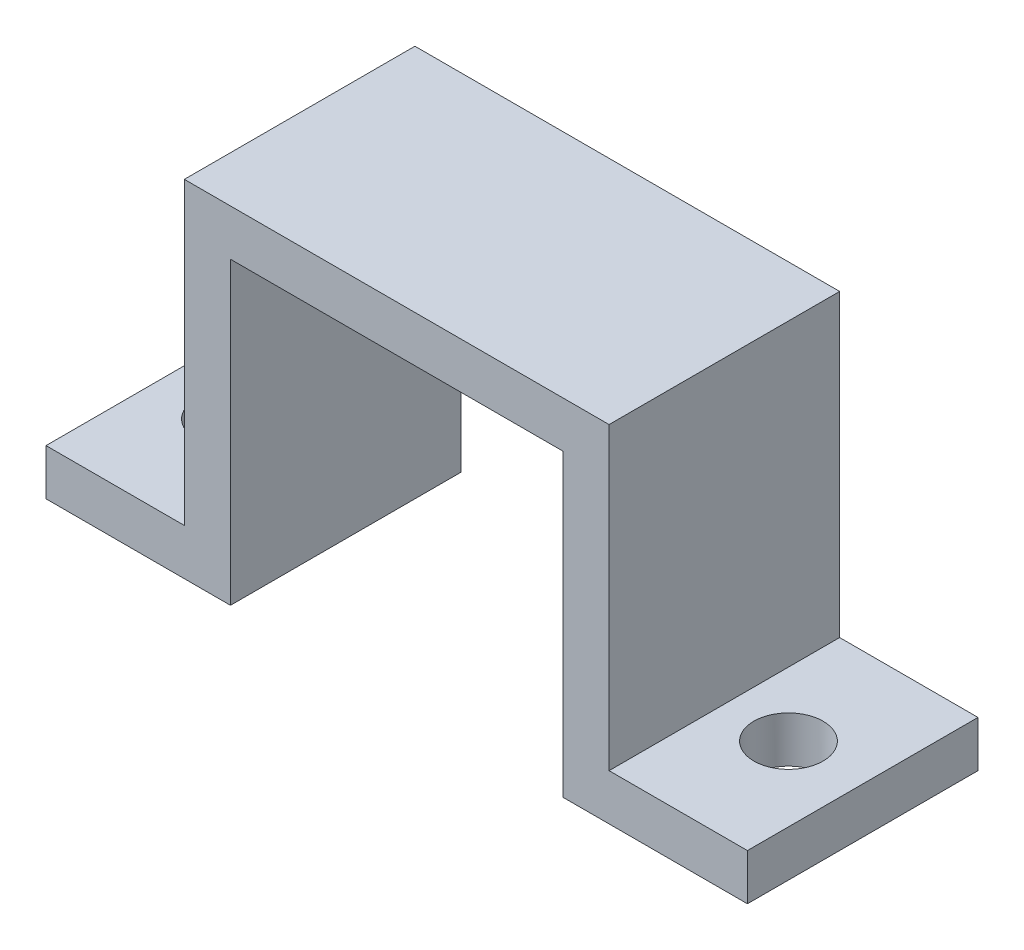
ISO-10303-21;
HEADER;
FILE_DESCRIPTION(('STEP AP214'),'2;1');
FILE_NAME('part.step','',(''),(''),'','','');
FILE_SCHEMA(('AUTOMOTIVE_DESIGN { 1 0 10303 214 1 1 1 1 }'));
ENDSEC;
DATA;
#1=APPLICATION_CONTEXT('core data for automotive mechanical design processes');
#2=APPLICATION_PROTOCOL_DEFINITION('international standard','automotive_design',2000,#1);
#3=PRODUCT_CONTEXT('',#1,'mechanical');
#4=PRODUCT('Part','Part','',(#3));
#5=PRODUCT_RELATED_PRODUCT_CATEGORY('part','',(#4));
#6=PRODUCT_DEFINITION_FORMATION('','',#4);
#7=PRODUCT_DEFINITION_CONTEXT('part definition',#1,'design');
#8=PRODUCT_DEFINITION('design','',#6,#7);
#9=PRODUCT_DEFINITION_SHAPE('','',#8);
#10=(LENGTH_UNIT() NAMED_UNIT(*) SI_UNIT(.MILLI.,.METRE.));
#11=(NAMED_UNIT(*) PLANE_ANGLE_UNIT() SI_UNIT($,.RADIAN.));
#12=(NAMED_UNIT(*) SI_UNIT($,.STERADIAN.) SOLID_ANGLE_UNIT());
#13=UNCERTAINTY_MEASURE_WITH_UNIT(LENGTH_MEASURE(1.E-05),#10,'distance_accuracy_value','');
#14=(GEOMETRIC_REPRESENTATION_CONTEXT(3) GLOBAL_UNCERTAINTY_ASSIGNED_CONTEXT((#13)) GLOBAL_UNIT_ASSIGNED_CONTEXT((#10,
#11,#12)) REPRESENTATION_CONTEXT('',''));
#15=CARTESIAN_POINT('',(0.,0.,0.));
#16=DIRECTION('',(0.,0.,1.));
#17=DIRECTION('',(1.,0.,0.));
#18=AXIS2_PLACEMENT_3D('',#15,#16,#17);
#19=CARTESIAN_POINT('',(-8.08835106382979,-3.52101063829787,10.));
#20=DIRECTION('',(0.,1.,0.));
#21=DIRECTION('',(-1.,0.,0.));
#22=AXIS2_PLACEMENT_3D('',#19,#20,#21);
#23=PLANE('',#22);
#24=CARTESIAN_POINT('',(-13.0883510638298,-3.52101063829787,5.));
#25=DIRECTION('',(0.,1.,0.));
#26=DIRECTION('',(0.,0.,1.));
#27=AXIS2_PLACEMENT_3D('',#24,#25,#26);
#28=CIRCLE('',#27,1.5);
#29=CARTESIAN_POINT('',(-13.0883510638298,-3.52101063829787,6.5));
#30=VERTEX_POINT('',#29);
#31=EDGE_CURVE('E240',#30,#30,#28,.T.);
#32=ORIENTED_EDGE('',*,*,#31,.T.);
#33=EDGE_LOOP('',(#32));
#34=FACE_BOUND('',#33,.T.);
#35=DIRECTION('',(1.,0.,0.));
#36=VECTOR('',#35,1.);
#37=CARTESIAN_POINT('',(-8.08835106382979,-3.52101063829787,0.));
#38=LINE('',#37,#36);
#39=CARTESIAN_POINT('',(-16.0883510638298,-3.52101063829787,0.));
#40=VERTEX_POINT('',#39);
#41=CARTESIAN_POINT('',(-8.08835106382979,-3.52101063829787,0.));
#42=VERTEX_POINT('',#41);
#43=EDGE_CURVE('E170',#40,#42,#38,.T.);
#44=ORIENTED_EDGE('',*,*,#43,.T.);
#45=DIRECTION('',(0.,0.,-1.));
#46=VECTOR('',#45,1.);
#47=CARTESIAN_POINT('',(-8.08835106382979,-3.52101063829787,10.));
#48=LINE('',#47,#46);
#49=CARTESIAN_POINT('',(-8.08835106382979,-3.52101063829787,10.));
#50=VERTEX_POINT('',#49);
#51=EDGE_CURVE('E11',#50,#42,#48,.T.);
#52=ORIENTED_EDGE('',*,*,#51,.F.);
#53=DIRECTION('',(1.,0.,0.));
#54=VECTOR('',#53,1.);
#55=CARTESIAN_POINT('',(-8.08835106382979,-3.52101063829787,10.));
#56=LINE('',#55,#54);
#57=CARTESIAN_POINT('',(-16.0883510638298,-3.52101063829787,10.));
#58=VERTEX_POINT('',#57);
#59=EDGE_CURVE('E204',#58,#50,#56,.T.);
#60=ORIENTED_EDGE('',*,*,#59,.F.);
#61=DIRECTION('',(0.,0.,-1.));
#62=VECTOR('',#61,1.);
#63=CARTESIAN_POINT('',(-16.0883510638298,-3.52101063829787,10.));
#64=LINE('',#63,#62);
#65=EDGE_CURVE('E166',#58,#40,#64,.T.);
#66=ORIENTED_EDGE('',*,*,#65,.T.);
#67=EDGE_LOOP('',(#44,#52,#60,#66));
#68=FACE_BOUND('',#67,.T.);
#69=ADVANCED_FACE('F43',(#34,#68),#23,.F.);
#70=CARTESIAN_POINT('',(-8.08835106382979,9.47898936170213,10.));
#71=DIRECTION('',(-1.,0.,0.));
#72=DIRECTION('',(0.,-1.,0.));
#73=AXIS2_PLACEMENT_3D('',#70,#71,#72);
#74=PLANE('',#73);
#75=DIRECTION('',(0.,1.,0.));
#76=VECTOR('',#75,1.);
#77=CARTESIAN_POINT('',(-8.08835106382979,9.47898936170213,0.));
#78=LINE('',#77,#76);
#79=CARTESIAN_POINT('',(-8.08835106382979,9.47898936170213,0.));
#80=VERTEX_POINT('',#79);
#81=EDGE_CURVE('E174',#42,#80,#78,.T.);
#82=ORIENTED_EDGE('',*,*,#81,.T.);
#83=DIRECTION('',(0.,0.,-1.));
#84=VECTOR('',#83,1.);
#85=CARTESIAN_POINT('',(-8.08835106382979,9.47898936170213,10.));
#86=LINE('',#85,#84);
#87=CARTESIAN_POINT('',(-8.08835106382979,9.47898936170213,10.));
#88=VERTEX_POINT('',#87);
#89=EDGE_CURVE('E53',#88,#80,#86,.T.);
#90=ORIENTED_EDGE('',*,*,#89,.F.);
#91=DIRECTION('',(0.,1.,0.));
#92=VECTOR('',#91,1.);
#93=CARTESIAN_POINT('',(-8.08835106382979,9.47898936170213,10.));
#94=LINE('',#93,#92);
#95=EDGE_CURVE('E117',#50,#88,#94,.T.);
#96=ORIENTED_EDGE('',*,*,#95,.F.);
#97=ORIENTED_EDGE('',*,*,#51,.T.);
#98=EDGE_LOOP('',(#82,#90,#96,#97));
#99=FACE_BOUND('',#98,.T.);
#100=ADVANCED_FACE('F305',(#99),#74,.F.);
#101=CARTESIAN_POINT('',(6.33164893617021,9.47898936170213,10.));
#102=DIRECTION('',(0.,1.,0.));
#103=DIRECTION('',(-1.,0.,0.));
#104=AXIS2_PLACEMENT_3D('',#101,#102,#103);
#105=PLANE('',#104);
#106=DIRECTION('',(1.,0.,0.));
#107=VECTOR('',#106,1.);
#108=CARTESIAN_POINT('',(6.33164893617021,9.47898936170213,0.));
#109=LINE('',#108,#107);
#110=CARTESIAN_POINT('',(6.33164893617021,9.47898936170213,0.));
#111=VERTEX_POINT('',#110);
#112=EDGE_CURVE('E177',#80,#111,#109,.T.);
#113=ORIENTED_EDGE('',*,*,#112,.T.);
#114=DIRECTION('',(0.,0.,-1.));
#115=VECTOR('',#114,1.);
#116=CARTESIAN_POINT('',(6.33164893617021,9.47898936170213,10.));
#117=LINE('',#116,#115);
#118=CARTESIAN_POINT('',(6.33164893617021,9.47898936170213,10.));
#119=VERTEX_POINT('',#118);
#120=EDGE_CURVE('E231',#119,#111,#117,.T.);
#121=ORIENTED_EDGE('',*,*,#120,.F.);
#122=DIRECTION('',(1.,0.,0.));
#123=VECTOR('',#122,1.);
#124=CARTESIAN_POINT('',(6.33164893617021,9.47898936170213,10.));
#125=LINE('',#124,#123);
#126=EDGE_CURVE('E259',#88,#119,#125,.T.);
#127=ORIENTED_EDGE('',*,*,#126,.F.);
#128=ORIENTED_EDGE('',*,*,#89,.T.);
#129=EDGE_LOOP('',(#113,#121,#127,#128));
#130=FACE_BOUND('',#129,.T.);
#131=ADVANCED_FACE('F309',(#130),#105,.F.);
#132=CARTESIAN_POINT('',(6.33164893617021,-3.52101063829787,10.));
#133=DIRECTION('',(1.,0.,0.));
#134=DIRECTION('',(0.,1.,0.));
#135=AXIS2_PLACEMENT_3D('',#132,#133,#134);
#136=PLANE('',#135);
#137=DIRECTION('',(0.,-1.,0.));
#138=VECTOR('',#137,1.);
#139=CARTESIAN_POINT('',(6.33164893617021,-3.52101063829787,0.));
#140=LINE('',#139,#138);
#141=CARTESIAN_POINT('',(6.33164893617021,-3.52101063829787,0.));
#142=VERTEX_POINT('',#141);
#143=EDGE_CURVE('E180',#111,#142,#140,.T.);
#144=ORIENTED_EDGE('',*,*,#143,.T.);
#145=DIRECTION('',(0.,0.,-1.));
#146=VECTOR('',#145,1.);
#147=CARTESIAN_POINT('',(6.33164893617021,-3.52101063829787,10.));
#148=LINE('',#147,#146);
#149=CARTESIAN_POINT('',(6.33164893617021,-3.52101063829787,10.));
#150=VERTEX_POINT('',#149);
#151=EDGE_CURVE('E227',#150,#142,#148,.T.);
#152=ORIENTED_EDGE('',*,*,#151,.F.);
#153=DIRECTION('',(0.,-1.,0.));
#154=VECTOR('',#153,1.);
#155=CARTESIAN_POINT('',(6.33164893617021,-3.52101063829787,10.));
#156=LINE('',#155,#154);
#157=EDGE_CURVE('E262',#119,#150,#156,.T.);
#158=ORIENTED_EDGE('',*,*,#157,.F.);
#159=ORIENTED_EDGE('',*,*,#120,.T.);
#160=EDGE_LOOP('',(#144,#152,#158,#159));
#161=FACE_BOUND('',#160,.T.);
#162=ADVANCED_FACE('F313',(#161),#136,.F.);
#163=CARTESIAN_POINT('',(14.3316489361702,-3.52101063829787,10.));
#164=DIRECTION('',(0.,1.,0.));
#165=DIRECTION('',(-1.,0.,0.));
#166=AXIS2_PLACEMENT_3D('',#163,#164,#165);
#167=PLANE('',#166);
#168=CARTESIAN_POINT('',(11.1120565121446,-3.52101063829787,5.));
#169=DIRECTION('',(0.,1.,0.));
#170=DIRECTION('',(0.,0.,1.));
#171=AXIS2_PLACEMENT_3D('',#168,#169,#170);
#172=CIRCLE('',#171,1.5);
#173=CARTESIAN_POINT('',(11.1120565121446,-3.52101063829787,6.5));
#174=VERTEX_POINT('',#173);
#175=EDGE_CURVE('E247',#174,#174,#172,.T.);
#176=ORIENTED_EDGE('',*,*,#175,.T.);
#177=EDGE_LOOP('',(#176));
#178=FACE_BOUND('',#177,.T.);
#179=DIRECTION('',(1.,0.,0.));
#180=VECTOR('',#179,1.);
#181=CARTESIAN_POINT('',(14.3316489361702,-3.52101063829787,0.));
#182=LINE('',#181,#180);
#183=CARTESIAN_POINT('',(14.3316489361702,-3.52101063829787,0.));
#184=VERTEX_POINT('',#183);
#185=EDGE_CURVE('E183',#142,#184,#182,.T.);
#186=ORIENTED_EDGE('',*,*,#185,.T.);
#187=DIRECTION('',(0.,0.,-1.));
#188=VECTOR('',#187,1.);
#189=CARTESIAN_POINT('',(14.3316489361702,-3.52101063829787,10.));
#190=LINE('',#189,#188);
#191=CARTESIAN_POINT('',(14.3316489361702,-3.52101063829787,10.));
#192=VERTEX_POINT('',#191);
#193=EDGE_CURVE('E223',#192,#184,#190,.T.);
#194=ORIENTED_EDGE('',*,*,#193,.F.);
#195=DIRECTION('',(1.,0.,0.));
#196=VECTOR('',#195,1.);
#197=CARTESIAN_POINT('',(14.3316489361702,-3.52101063829787,10.));
#198=LINE('',#197,#196);
#199=EDGE_CURVE('E265',#150,#192,#198,.T.);
#200=ORIENTED_EDGE('',*,*,#199,.F.);
#201=ORIENTED_EDGE('',*,*,#151,.T.);
#202=EDGE_LOOP('',(#186,#194,#200,#201));
#203=FACE_BOUND('',#202,.T.);
#204=ADVANCED_FACE('F319',(#178,#203),#167,.F.);
#205=CARTESIAN_POINT('',(14.3316489361702,-1.52101063829787,10.));
#206=DIRECTION('',(-1.,0.,0.));
#207=DIRECTION('',(0.,0.,1.));
#208=AXIS2_PLACEMENT_3D('',#205,#206,#207);
#209=PLANE('',#208);
#210=DIRECTION('',(0.,1.,0.));
#211=VECTOR('',#210,1.);
#212=CARTESIAN_POINT('',(14.3316489361702,-1.52101063829787,0.));
#213=LINE('',#212,#211);
#214=CARTESIAN_POINT('',(14.3316489361702,-1.52101063829787,0.));
#215=VERTEX_POINT('',#214);
#216=EDGE_CURVE('E186',#184,#215,#213,.T.);
#217=ORIENTED_EDGE('',*,*,#216,.T.);
#218=DIRECTION('',(0.,0.,-1.));
#219=VECTOR('',#218,1.);
#220=CARTESIAN_POINT('',(14.3316489361702,-1.52101063829787,10.));
#221=LINE('',#220,#219);
#222=CARTESIAN_POINT('',(14.3316489361702,-1.52101063829787,10.));
#223=VERTEX_POINT('',#222);
#224=EDGE_CURVE('E219',#223,#215,#221,.T.);
#225=ORIENTED_EDGE('',*,*,#224,.F.);
#226=DIRECTION('',(0.,1.,0.));
#227=VECTOR('',#226,1.);
#228=CARTESIAN_POINT('',(14.3316489361702,-1.52101063829787,10.));
#229=LINE('',#228,#227);
#230=EDGE_CURVE('E268',#192,#223,#229,.T.);
#231=ORIENTED_EDGE('',*,*,#230,.F.);
#232=ORIENTED_EDGE('',*,*,#193,.T.);
#233=EDGE_LOOP('',(#217,#225,#231,#232));
#234=FACE_BOUND('',#233,.T.);
#235=ADVANCED_FACE('F323',(#234),#209,.F.);
#236=CARTESIAN_POINT('',(8.33164893617021,-1.52101063829787,10.));
#237=DIRECTION('',(0.,-1.,0.));
#238=DIRECTION('',(0.,0.,-1.));
#239=AXIS2_PLACEMENT_3D('',#236,#237,#238);
#240=PLANE('',#239);
#241=CARTESIAN_POINT('',(11.1120565121446,-1.52101063829787,5.));
#242=DIRECTION('',(0.,-1.,0.));
#243=DIRECTION('',(0.,0.,-1.));
#244=AXIS2_PLACEMENT_3D('',#241,#242,#243);
#245=CIRCLE('',#244,1.5);
#246=CARTESIAN_POINT('',(11.1120565121446,-1.52101063829787,3.5));
#247=VERTEX_POINT('',#246);
#248=EDGE_CURVE('E46',#247,#247,#245,.T.);
#249=ORIENTED_EDGE('',*,*,#248,.T.);
#250=EDGE_LOOP('',(#249));
#251=FACE_BOUND('',#250,.T.);
#252=DIRECTION('',(-1.,0.,0.));
#253=VECTOR('',#252,1.);
#254=CARTESIAN_POINT('',(8.33164893617021,-1.52101063829787,0.));
#255=LINE('',#254,#253);
#256=CARTESIAN_POINT('',(8.33164893617021,-1.52101063829787,0.));
#257=VERTEX_POINT('',#256);
#258=EDGE_CURVE('E189',#215,#257,#255,.T.);
#259=ORIENTED_EDGE('',*,*,#258,.T.);
#260=DIRECTION('',(0.,0.,-1.));
#261=VECTOR('',#260,1.);
#262=CARTESIAN_POINT('',(8.33164893617021,-1.52101063829787,10.));
#263=LINE('',#262,#261);
#264=CARTESIAN_POINT('',(8.33164893617021,-1.52101063829787,10.));
#265=VERTEX_POINT('',#264);
#266=EDGE_CURVE('E215',#265,#257,#263,.T.);
#267=ORIENTED_EDGE('',*,*,#266,.F.);
#268=DIRECTION('',(-1.,0.,0.));
#269=VECTOR('',#268,1.);
#270=CARTESIAN_POINT('',(8.33164893617021,-1.52101063829787,10.));
#271=LINE('',#270,#269);
#272=EDGE_CURVE('E271',#223,#265,#271,.T.);
#273=ORIENTED_EDGE('',*,*,#272,.F.);
#274=ORIENTED_EDGE('',*,*,#224,.T.);
#275=EDGE_LOOP('',(#259,#267,#273,#274));
#276=FACE_BOUND('',#275,.T.);
#277=ADVANCED_FACE('F327',(#251,#276),#240,.F.);
#278=CARTESIAN_POINT('',(8.33164893617021,11.4789893617021,10.));
#279=DIRECTION('',(-1.,0.,0.));
#280=DIRECTION('',(0.,-1.,0.));
#281=AXIS2_PLACEMENT_3D('',#278,#279,#280);
#282=PLANE('',#281);
#283=DIRECTION('',(0.,1.,0.));
#284=VECTOR('',#283,1.);
#285=CARTESIAN_POINT('',(8.33164893617021,11.4789893617021,0.));
#286=LINE('',#285,#284);
#287=CARTESIAN_POINT('',(8.33164893617021,11.4789893617021,0.));
#288=VERTEX_POINT('',#287);
#289=EDGE_CURVE('E192',#257,#288,#286,.T.);
#290=ORIENTED_EDGE('',*,*,#289,.T.);
#291=DIRECTION('',(0.,0.,-1.));
#292=VECTOR('',#291,1.);
#293=CARTESIAN_POINT('',(8.33164893617021,11.4789893617021,10.));
#294=LINE('',#293,#292);
#295=CARTESIAN_POINT('',(8.33164893617021,11.4789893617021,10.));
#296=VERTEX_POINT('',#295);
#297=EDGE_CURVE('E211',#296,#288,#294,.T.);
#298=ORIENTED_EDGE('',*,*,#297,.F.);
#299=DIRECTION('',(0.,1.,0.));
#300=VECTOR('',#299,1.);
#301=CARTESIAN_POINT('',(8.33164893617021,11.4789893617021,10.));
#302=LINE('',#301,#300);
#303=EDGE_CURVE('E274',#265,#296,#302,.T.);
#304=ORIENTED_EDGE('',*,*,#303,.F.);
#305=ORIENTED_EDGE('',*,*,#266,.T.);
#306=EDGE_LOOP('',(#290,#298,#304,#305));
#307=FACE_BOUND('',#306,.T.);
#308=ADVANCED_FACE('F282',(#307),#282,.F.);
#309=CARTESIAN_POINT('',(-10.0883510638298,11.4789893617021,10.));
#310=DIRECTION('',(0.,-1.,0.));
#311=DIRECTION('',(0.,0.,-1.));
#312=AXIS2_PLACEMENT_3D('',#309,#310,#311);
#313=PLANE('',#312);
#314=DIRECTION('',(-1.,0.,0.));
#315=VECTOR('',#314,1.);
#316=CARTESIAN_POINT('',(-10.0883510638298,11.4789893617021,0.));
#317=LINE('',#316,#315);
#318=CARTESIAN_POINT('',(-10.0883510638298,11.4789893617021,0.));
#319=VERTEX_POINT('',#318);
#320=EDGE_CURVE('E195',#288,#319,#317,.T.);
#321=ORIENTED_EDGE('',*,*,#320,.T.);
#322=DIRECTION('',(0.,0.,-1.));
#323=VECTOR('',#322,1.);
#324=CARTESIAN_POINT('',(-10.0883510638298,11.4789893617021,10.));
#325=LINE('',#324,#323);
#326=CARTESIAN_POINT('',(-10.0883510638298,11.4789893617021,10.));
#327=VERTEX_POINT('',#326);
#328=EDGE_CURVE('E159',#327,#319,#325,.T.);
#329=ORIENTED_EDGE('',*,*,#328,.F.);
#330=DIRECTION('',(-1.,0.,0.));
#331=VECTOR('',#330,1.);
#332=CARTESIAN_POINT('',(-10.0883510638298,11.4789893617021,10.));
#333=LINE('',#332,#331);
#334=EDGE_CURVE('E148',#296,#327,#333,.T.);
#335=ORIENTED_EDGE('',*,*,#334,.F.);
#336=ORIENTED_EDGE('',*,*,#297,.T.);
#337=EDGE_LOOP('',(#321,#329,#335,#336));
#338=FACE_BOUND('',#337,.T.);
#339=ADVANCED_FACE('F286',(#338),#313,.F.);
#340=CARTESIAN_POINT('',(-10.0883510638298,-1.52101063829787,10.));
#341=DIRECTION('',(1.,0.,0.));
#342=DIRECTION('',(0.,1.,0.));
#343=AXIS2_PLACEMENT_3D('',#340,#341,#342);
#344=PLANE('',#343);
#345=DIRECTION('',(0.,-1.,0.));
#346=VECTOR('',#345,1.);
#347=CARTESIAN_POINT('',(-10.0883510638298,-1.52101063829787,0.));
#348=LINE('',#347,#346);
#349=CARTESIAN_POINT('',(-10.0883510638298,-1.52101063829787,0.));
#350=VERTEX_POINT('',#349);
#351=EDGE_CURVE('E157',#319,#350,#348,.T.);
#352=ORIENTED_EDGE('',*,*,#351,.T.);
#353=DIRECTION('',(0.,0.,-1.));
#354=VECTOR('',#353,1.);
#355=CARTESIAN_POINT('',(-10.0883510638298,-1.52101063829787,10.));
#356=LINE('',#355,#354);
#357=CARTESIAN_POINT('',(-10.0883510638298,-1.52101063829787,10.));
#358=VERTEX_POINT('',#357);
#359=EDGE_CURVE('E154',#358,#350,#356,.T.);
#360=ORIENTED_EDGE('',*,*,#359,.F.);
#361=DIRECTION('',(0.,-1.,0.));
#362=VECTOR('',#361,1.);
#363=CARTESIAN_POINT('',(-10.0883510638298,-1.52101063829787,10.));
#364=LINE('',#363,#362);
#365=EDGE_CURVE('E142',#327,#358,#364,.T.);
#366=ORIENTED_EDGE('',*,*,#365,.F.);
#367=ORIENTED_EDGE('',*,*,#328,.T.);
#368=EDGE_LOOP('',(#352,#360,#366,#367));
#369=FACE_BOUND('',#368,.T.);
#370=ADVANCED_FACE('F155',(#369),#344,.F.);
#371=CARTESIAN_POINT('',(-16.0883510638298,-1.52101063829787,10.));
#372=DIRECTION('',(0.,-1.,0.));
#373=DIRECTION('',(0.,0.,-1.));
#374=AXIS2_PLACEMENT_3D('',#371,#372,#373);
#375=PLANE('',#374);
#376=CARTESIAN_POINT('',(-13.0883510638298,-1.52101063829787,5.));
#377=DIRECTION('',(0.,-1.,0.));
#378=DIRECTION('',(0.,0.,-1.));
#379=AXIS2_PLACEMENT_3D('',#376,#377,#378);
#380=CIRCLE('',#379,1.5);
#381=CARTESIAN_POINT('',(-13.0883510638298,-1.52101063829787,3.5));
#382=VERTEX_POINT('',#381);
#383=EDGE_CURVE('E237',#382,#382,#380,.T.);
#384=ORIENTED_EDGE('',*,*,#383,.T.);
#385=EDGE_LOOP('',(#384));
#386=FACE_BOUND('',#385,.T.);
#387=DIRECTION('',(-1.,0.,0.));
#388=VECTOR('',#387,1.);
#389=CARTESIAN_POINT('',(-16.0883510638298,-1.52101063829787,0.));
#390=LINE('',#389,#388);
#391=CARTESIAN_POINT('',(-16.0883510638298,-1.52101063829787,0.));
#392=VERTEX_POINT('',#391);
#393=EDGE_CURVE('E103',#350,#392,#390,.T.);
#394=ORIENTED_EDGE('',*,*,#393,.T.);
#395=DIRECTION('',(0.,0.,-1.));
#396=VECTOR('',#395,1.);
#397=CARTESIAN_POINT('',(-16.0883510638298,-1.52101063829787,10.));
#398=LINE('',#397,#396);
#399=CARTESIAN_POINT('',(-16.0883510638298,-1.52101063829787,10.));
#400=VERTEX_POINT('',#399);
#401=EDGE_CURVE('E160',#400,#392,#398,.T.);
#402=ORIENTED_EDGE('',*,*,#401,.F.);
#403=DIRECTION('',(-1.,0.,0.));
#404=VECTOR('',#403,1.);
#405=CARTESIAN_POINT('',(-16.0883510638298,-1.52101063829787,10.));
#406=LINE('',#405,#404);
#407=EDGE_CURVE('E146',#358,#400,#406,.T.);
#408=ORIENTED_EDGE('',*,*,#407,.F.);
#409=ORIENTED_EDGE('',*,*,#359,.T.);
#410=EDGE_LOOP('',(#394,#402,#408,#409));
#411=FACE_BOUND('',#410,.T.);
#412=ADVANCED_FACE('F162',(#386,#411),#375,.F.);
#413=CARTESIAN_POINT('',(-16.0883510638298,-3.52101063829787,10.));
#414=DIRECTION('',(1.,0.,0.));
#415=DIRECTION('',(0.,0.,-1.));
#416=AXIS2_PLACEMENT_3D('',#413,#414,#415);
#417=PLANE('',#416);
#418=DIRECTION('',(0.,-1.,0.));
#419=VECTOR('',#418,1.);
#420=CARTESIAN_POINT('',(-16.0883510638298,-3.52101063829787,0.));
#421=LINE('',#420,#419);
#422=EDGE_CURVE('E109',#392,#40,#421,.T.);
#423=ORIENTED_EDGE('',*,*,#422,.T.);
#424=ORIENTED_EDGE('',*,*,#65,.F.);
#425=DIRECTION('',(0.,-1.,0.));
#426=VECTOR('',#425,1.);
#427=CARTESIAN_POINT('',(-16.0883510638298,-3.52101063829787,10.));
#428=LINE('',#427,#426);
#429=EDGE_CURVE('E62',#400,#58,#428,.T.);
#430=ORIENTED_EDGE('',*,*,#429,.F.);
#431=ORIENTED_EDGE('',*,*,#401,.T.);
#432=EDGE_LOOP('',(#423,#424,#430,#431));
#433=FACE_BOUND('',#432,.T.);
#434=ADVANCED_FACE('F294',(#433),#417,.F.);
#435=CARTESIAN_POINT('',(0.,0.,10.));
#436=DIRECTION('',(0.,0.,-1.));
#437=DIRECTION('',(-1.,0.,0.));
#438=AXIS2_PLACEMENT_3D('',#435,#436,#437);
#439=PLANE('',#438);
#440=ORIENTED_EDGE('',*,*,#59,.T.);
#441=ORIENTED_EDGE('',*,*,#95,.T.);
#442=ORIENTED_EDGE('',*,*,#126,.T.);
#443=ORIENTED_EDGE('',*,*,#157,.T.);
#444=ORIENTED_EDGE('',*,*,#199,.T.);
#445=ORIENTED_EDGE('',*,*,#230,.T.);
#446=ORIENTED_EDGE('',*,*,#272,.T.);
#447=ORIENTED_EDGE('',*,*,#303,.T.);
#448=ORIENTED_EDGE('',*,*,#334,.T.);
#449=ORIENTED_EDGE('',*,*,#365,.T.);
#450=ORIENTED_EDGE('',*,*,#407,.T.);
#451=ORIENTED_EDGE('',*,*,#429,.T.);
#452=EDGE_LOOP('',(#440,#441,#442,#443,#444,#445,#446,#447,#448,#449,#450,#451));
#453=FACE_BOUND('',#452,.T.);
#454=ADVANCED_FACE('F144',(#453),#439,.F.);
#455=CARTESIAN_POINT('',(0.,0.,0.));
#456=DIRECTION('',(0.,0.,-1.));
#457=DIRECTION('',(-1.,0.,0.));
#458=AXIS2_PLACEMENT_3D('',#455,#456,#457);
#459=PLANE('',#458);
#460=ORIENTED_EDGE('',*,*,#43,.F.);
#461=ORIENTED_EDGE('',*,*,#422,.F.);
#462=ORIENTED_EDGE('',*,*,#393,.F.);
#463=ORIENTED_EDGE('',*,*,#351,.F.);
#464=ORIENTED_EDGE('',*,*,#320,.F.);
#465=ORIENTED_EDGE('',*,*,#289,.F.);
#466=ORIENTED_EDGE('',*,*,#258,.F.);
#467=ORIENTED_EDGE('',*,*,#216,.F.);
#468=ORIENTED_EDGE('',*,*,#185,.F.);
#469=ORIENTED_EDGE('',*,*,#143,.F.);
#470=ORIENTED_EDGE('',*,*,#112,.F.);
#471=ORIENTED_EDGE('',*,*,#81,.F.);
#472=EDGE_LOOP('',(#460,#461,#462,#463,#464,#465,#466,#467,#468,#469,#470,#471));
#473=FACE_BOUND('',#472,.T.);
#474=ADVANCED_FACE('F289',(#473),#459,.T.);
#475=CARTESIAN_POINT('',(-13.0883510638298,-3.52101063829787,5.));
#476=DIRECTION('',(0.,1.,0.));
#477=DIRECTION('',(0.,0.,1.));
#478=AXIS2_PLACEMENT_3D('',#475,#476,#477);
#479=CYLINDRICAL_SURFACE('',#478,1.5);
#480=ORIENTED_EDGE('',*,*,#31,.F.);
#481=EDGE_LOOP('',(#480));
#482=FACE_BOUND('',#481,.T.);
#483=ORIENTED_EDGE('',*,*,#383,.F.);
#484=EDGE_LOOP('',(#483));
#485=FACE_BOUND('',#484,.T.);
#486=ADVANCED_FACE('F356',(#482,#485),#479,.F.);
#487=CARTESIAN_POINT('',(11.1120565121446,-3.52101063829787,5.));
#488=DIRECTION('',(0.,1.,0.));
#489=DIRECTION('',(0.,0.,1.));
#490=AXIS2_PLACEMENT_3D('',#487,#488,#489);
#491=CYLINDRICAL_SURFACE('',#490,1.5);
#492=ORIENTED_EDGE('',*,*,#175,.F.);
#493=EDGE_LOOP('',(#492));
#494=FACE_BOUND('',#493,.T.);
#495=ORIENTED_EDGE('',*,*,#248,.F.);
#496=EDGE_LOOP('',(#495));
#497=FACE_BOUND('',#496,.T.);
#498=ADVANCED_FACE('F361',(#494,#497),#491,.F.);
#499=CLOSED_SHELL('',(#69,#100,#131,#162,#204,#235,#277,#308,#339,#370,#412,#434,#454,#474,#486,#498));
#500=MANIFOLD_SOLID_BREP('B2',#499);
#501=ADVANCED_BREP_SHAPE_REPRESENTATION('',(#18,#500),#14);
#502=SHAPE_DEFINITION_REPRESENTATION(#9,#501);
ENDSEC;
END-ISO-10303-21;
